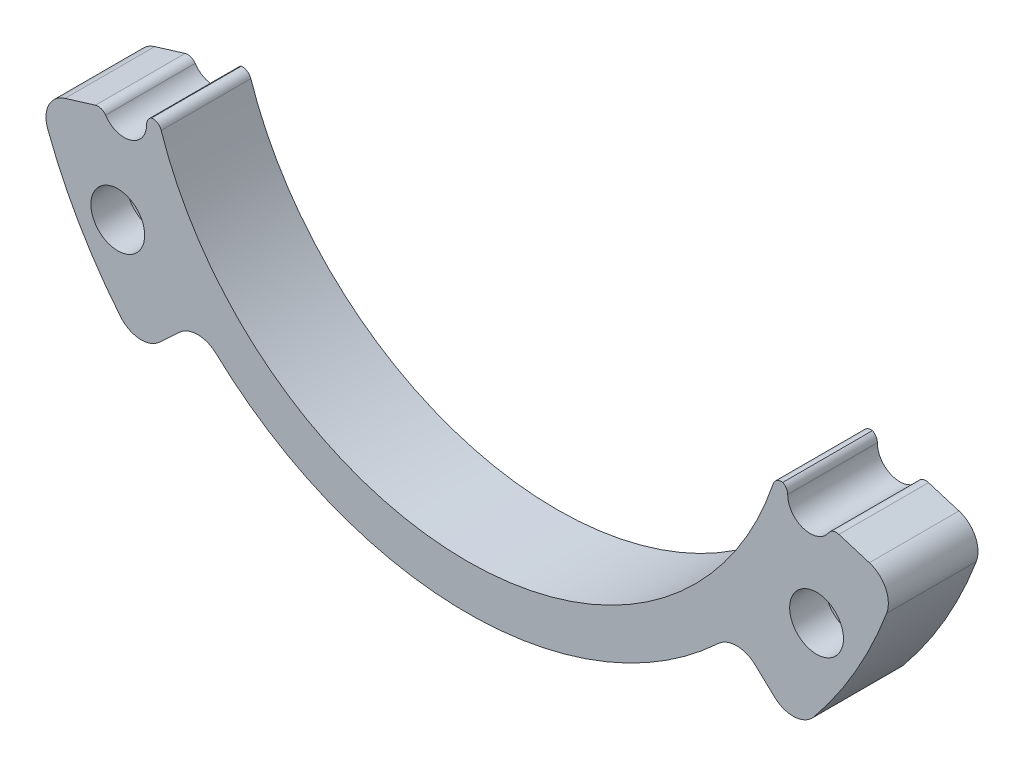
ISO-10303-21;
HEADER;
FILE_DESCRIPTION(('STEP AP214'),'2;1');
FILE_NAME('part.step','',(''),(''),'','','');
FILE_SCHEMA(('AUTOMOTIVE_DESIGN { 1 0 10303 214 1 1 1 1 }'));
ENDSEC;
DATA;
#1=APPLICATION_CONTEXT('core data for automotive mechanical design processes');
#2=APPLICATION_PROTOCOL_DEFINITION('international standard','automotive_design',2000,#1);
#3=PRODUCT_CONTEXT('',#1,'mechanical');
#4=PRODUCT('Part','Part','',(#3));
#5=PRODUCT_RELATED_PRODUCT_CATEGORY('part','',(#4));
#6=PRODUCT_DEFINITION_FORMATION('','',#4);
#7=PRODUCT_DEFINITION_CONTEXT('part definition',#1,'design');
#8=PRODUCT_DEFINITION('design','',#6,#7);
#9=PRODUCT_DEFINITION_SHAPE('','',#8);
#10=(LENGTH_UNIT() NAMED_UNIT(*) SI_UNIT(.MILLI.,.METRE.));
#11=(NAMED_UNIT(*) PLANE_ANGLE_UNIT() SI_UNIT($,.RADIAN.));
#12=(NAMED_UNIT(*) SI_UNIT($,.STERADIAN.) SOLID_ANGLE_UNIT());
#13=UNCERTAINTY_MEASURE_WITH_UNIT(LENGTH_MEASURE(1.E-05),#10,'distance_accuracy_value','');
#14=(GEOMETRIC_REPRESENTATION_CONTEXT(3) GLOBAL_UNCERTAINTY_ASSIGNED_CONTEXT((#13)) GLOBAL_UNIT_ASSIGNED_CONTEXT((#10,
#11,#12)) REPRESENTATION_CONTEXT('',''));
#15=CARTESIAN_POINT('',(0.,0.,0.));
#16=DIRECTION('',(0.,0.,1.));
#17=DIRECTION('',(1.,0.,0.));
#18=AXIS2_PLACEMENT_3D('',#15,#16,#17);
#19=CARTESIAN_POINT('',(38.9711431702997,-22.4999999999999,10.));
#20=DIRECTION('',(0.,0.,-1.));
#21=DIRECTION('',(-1.,0.,0.));
#22=AXIS2_PLACEMENT_3D('',#19,#20,#21);
#23=CYLINDRICAL_SURFACE('',#22,1.60000000000003);
#24=CARTESIAN_POINT('',(38.9711431702997,-22.4999999999999,0.));
#25=DIRECTION('',(0.,0.,1.));
#26=DIRECTION('',(1.,0.,0.));
#27=AXIS2_PLACEMENT_3D('',#24,#25,#26);
#28=CIRCLE('',#27,1.60000000000003);
#29=CARTESIAN_POINT('',(40.5711431702998,-22.4999999999999,0.));
#30=VERTEX_POINT('',#29);
#31=EDGE_CURVE('E382',#30,#30,#28,.T.);
#32=ORIENTED_EDGE('',*,*,#31,.F.);
#33=EDGE_LOOP('',(#32));
#34=FACE_BOUND('',#33,.T.);
#35=CARTESIAN_POINT('',(38.9711431702997,-22.4999999999999,6.));
#36=DIRECTION('',(0.,0.,1.));
#37=DIRECTION('',(1.,0.,0.));
#38=AXIS2_PLACEMENT_3D('',#35,#36,#37);
#39=CIRCLE('',#38,1.60000000000003);
#40=CARTESIAN_POINT('',(40.5711431702998,-22.4999999999999,6.));
#41=VERTEX_POINT('',#40);
#42=EDGE_CURVE('E222',#41,#41,#39,.T.);
#43=ORIENTED_EDGE('',*,*,#42,.T.);
#44=EDGE_LOOP('',(#43));
#45=FACE_BOUND('',#44,.T.);
#46=ADVANCED_FACE('F34',(#34,#45),#23,.F.);
#47=CARTESIAN_POINT('',(-38.9711431702998,-22.4999999999999,10.));
#48=DIRECTION('',(0.,0.,-1.));
#49=DIRECTION('',(-1.,0.,0.));
#50=AXIS2_PLACEMENT_3D('',#47,#48,#49);
#51=CYLINDRICAL_SURFACE('',#50,1.60000000000002);
#52=CARTESIAN_POINT('',(-38.9711431702998,-22.4999999999999,0.));
#53=DIRECTION('',(0.,0.,1.));
#54=DIRECTION('',(1.,0.,0.));
#55=AXIS2_PLACEMENT_3D('',#52,#53,#54);
#56=CIRCLE('',#55,1.60000000000002);
#57=CARTESIAN_POINT('',(-37.3711431702998,-22.4999999999999,0.));
#58=VERTEX_POINT('',#57);
#59=EDGE_CURVE('E349',#58,#58,#56,.T.);
#60=ORIENTED_EDGE('',*,*,#59,.F.);
#61=EDGE_LOOP('',(#60));
#62=FACE_BOUND('',#61,.T.);
#63=CARTESIAN_POINT('',(-38.9711431702998,-22.4999999999999,6.));
#64=DIRECTION('',(0.,0.,1.));
#65=DIRECTION('',(1.,0.,0.));
#66=AXIS2_PLACEMENT_3D('',#63,#64,#65);
#67=CIRCLE('',#66,1.60000000000002);
#68=CARTESIAN_POINT('',(-37.3711431702998,-22.4999999999999,6.));
#69=VERTEX_POINT('',#68);
#70=EDGE_CURVE('E359',#69,#69,#67,.T.);
#71=ORIENTED_EDGE('',*,*,#70,.T.);
#72=EDGE_LOOP('',(#71));
#73=FACE_BOUND('',#72,.T.);
#74=ADVANCED_FACE('F467',(#62,#73),#51,.F.);
#75=CARTESIAN_POINT('',(34.4269712146693,-10.5253813700185,10.));
#76=DIRECTION('',(-0.292371704722734,-0.956304755963036,0.));
#77=DIRECTION('',(0.956304755963036,-0.292371704722734,0.));
#78=AXIS2_PLACEMENT_3D('',#75,#76,#77);
#79=PLANE('',#78);
#80=DIRECTION('',(-0.956304755963036,0.292371704722734,0.));
#81=VECTOR('',#80,1.);
#82=CARTESIAN_POINT('',(34.4269712146693,-10.5253813700185,10.));
#83=LINE('',#82,#81);
#84=CARTESIAN_POINT('',(44.8546689856311,-13.7134485155796,10.));
#85=VERTEX_POINT('',#84);
#86=CARTESIAN_POINT('',(41.4597339008309,-12.6755126985958,10.));
#87=VERTEX_POINT('',#86);
#88=EDGE_CURVE('E337',#85,#87,#83,.T.);
#89=ORIENTED_EDGE('',*,*,#88,.F.);
#90=DIRECTION('',(0.,0.,-1.));
#91=VECTOR('',#90,1.);
#92=CARTESIAN_POINT('',(44.8546689856311,-13.7134485155796,10.));
#93=LINE('',#92,#91);
#94=CARTESIAN_POINT('',(44.8546689856311,-13.7134485155796,0.));
#95=VERTEX_POINT('',#94);
#96=EDGE_CURVE('E192',#85,#95,#93,.T.);
#97=ORIENTED_EDGE('',*,*,#96,.T.);
#98=DIRECTION('',(-0.956304755963036,0.292371704722734,0.));
#99=VECTOR('',#98,1.);
#100=CARTESIAN_POINT('',(34.4269712146693,-10.5253813700185,0.));
#101=LINE('',#100,#99);
#102=CARTESIAN_POINT('',(41.4597339008309,-12.6755126985958,0.));
#103=VERTEX_POINT('',#102);
#104=EDGE_CURVE('E185',#95,#103,#101,.T.);
#105=ORIENTED_EDGE('',*,*,#104,.T.);
#106=DIRECTION('',(0.,0.,1.));
#107=VECTOR('',#106,1.);
#108=CARTESIAN_POINT('',(41.4597339008309,-12.6755126985958,10.));
#109=LINE('',#108,#107);
#110=EDGE_CURVE('E190',#103,#87,#109,.T.);
#111=ORIENTED_EDGE('',*,*,#110,.T.);
#112=EDGE_LOOP('',(#89,#97,#105,#111));
#113=FACE_BOUND('',#112,.T.);
#114=ADVANCED_FACE('F188',(#113),#79,.F.);
#115=CARTESIAN_POINT('',(0.,0.,10.));
#116=DIRECTION('',(0.,0.,1.));
#117=DIRECTION('',(1.,0.,0.));
#118=AXIS2_PLACEMENT_3D('',#115,#116,#117);
#119=PLANE('',#118);
#120=CARTESIAN_POINT('',(38.9711431702997,-22.4999999999999,10.));
#121=DIRECTION('',(0.,0.,1.));
#122=DIRECTION('',(1.,0.,0.));
#123=AXIS2_PLACEMENT_3D('',#120,#121,#122);
#124=CIRCLE('',#123,3.);
#125=CARTESIAN_POINT('',(41.9711431702997,-22.4999999999999,10.));
#126=VERTEX_POINT('',#125);
#127=EDGE_CURVE('E262',#126,#126,#124,.T.);
#128=ORIENTED_EDGE('',*,*,#127,.F.);
#129=EDGE_LOOP('',(#128));
#130=FACE_BOUND('',#129,.T.);
#131=CARTESIAN_POINT('',(-38.9711431702998,-22.4999999999999,10.));
#132=DIRECTION('',(0.,0.,1.));
#133=DIRECTION('',(1.,0.,0.));
#134=AXIS2_PLACEMENT_3D('',#131,#132,#133);
#135=CIRCLE('',#134,3.);
#136=CARTESIAN_POINT('',(-35.9711431702998,-22.4999999999999,10.));
#137=VERTEX_POINT('',#136);
#138=EDGE_CURVE('E368',#137,#137,#135,.T.);
#139=ORIENTED_EDGE('',*,*,#138,.F.);
#140=EDGE_LOOP('',(#139));
#141=FACE_BOUND('',#140,.T.);
#142=DIRECTION('',(-0.956304755963033,-0.292371704722746,0.));
#143=VECTOR('',#142,1.);
#144=CARTESIAN_POINT('',(-34.4269712146693,-10.5253813700185,10.));
#145=LINE('',#144,#143);
#146=CARTESIAN_POINT('',(-41.4597339008309,-12.6755126985958,10.));
#147=VERTEX_POINT('',#146);
#148=CARTESIAN_POINT('',(-44.8546689856312,-13.7134485155797,10.));
#149=VERTEX_POINT('',#148);
#150=EDGE_CURVE('E214',#147,#149,#145,.T.);
#151=ORIENTED_EDGE('',*,*,#150,.T.);
#152=CARTESIAN_POINT('',(-43.9775538714629,-16.5823627834688,10.));
#153=DIRECTION('',(0.,0.,1.));
#154=DIRECTION('',(1.,0.,0.));
#155=AXIS2_PLACEMENT_3D('',#152,#153,#154);
#156=CIRCLE('',#155,3.);
#157=CARTESIAN_POINT('',(-46.7846317781521,-17.6408114717754,10.));
#158=VERTEX_POINT('',#157);
#159=EDGE_CURVE('E285',#149,#158,#156,.T.);
#160=ORIENTED_EDGE('',*,*,#159,.T.);
#161=CARTESIAN_POINT('',(0.,0.,10.));
#162=DIRECTION('',(0.,0.,1.));
#163=DIRECTION('',(1.,0.,0.));
#164=AXIS2_PLACEMENT_3D('',#161,#162,#163);
#165=CIRCLE('',#164,50.);
#166=CARTESIAN_POINT('',(-38.6697067670053,-31.6962738906929,10.));
#167=VERTEX_POINT('',#166);
#168=EDGE_CURVE('E358',#158,#167,#165,.T.);
#169=ORIENTED_EDGE('',*,*,#168,.T.);
#170=CARTESIAN_POINT('',(-36.349524360985,-29.7944974572513,10.));
#171=DIRECTION('',(0.,0.,1.));
#172=DIRECTION('',(1.,0.,0.));
#173=AXIS2_PLACEMENT_3D('',#170,#171,#172);
#174=CIRCLE('',#173,3.);
#175=CARTESIAN_POINT('',(-34.3035292807975,-31.9885585621089,10.));
#176=VERTEX_POINT('',#175);
#177=EDGE_CURVE('E283',#167,#176,#174,.T.);
#178=ORIENTED_EDGE('',*,*,#177,.T.);
#179=DIRECTION('',(0.731353701619168,0.681998360062501,0.));
#180=VECTOR('',#179,1.);
#181=CARTESIAN_POINT('',(-29.9855017663859,-27.9619327625625,10.));
#182=LINE('',#181,#180);
#183=CARTESIAN_POINT('',(-32.1046782019764,-29.9380967589381,10.));
#184=VERTEX_POINT('',#183);
#185=EDGE_CURVE('E339',#176,#184,#182,.T.);
#186=ORIENTED_EDGE('',*,*,#185,.T.);
#187=CARTESIAN_POINT('',(-30.0586831217889,-32.1321578637956,10.));
#188=DIRECTION('',(0.,0.,1.));
#189=DIRECTION('',(1.,0.,0.));
#190=AXIS2_PLACEMENT_3D('',#187,#188,#189);
#191=CIRCLE('',#190,3.);
#192=CARTESIAN_POINT('',(-28.0092274543942,-29.9413289185368,10.));
#193=VERTEX_POINT('',#192);
#194=EDGE_CURVE('E309',#184,#193,#191,.F.);
#195=ORIENTED_EDGE('',*,*,#194,.T.);
#196=CARTESIAN_POINT('',(0.,0.,10.));
#197=DIRECTION('',(0.,0.,1.));
#198=DIRECTION('',(1.,0.,0.));
#199=AXIS2_PLACEMENT_3D('',#196,#197,#198);
#200=CIRCLE('',#199,41.);
#201=CARTESIAN_POINT('',(28.0092274543944,-29.9413289185366,10.));
#202=VERTEX_POINT('',#201);
#203=EDGE_CURVE('E331',#193,#202,#200,.T.);
#204=ORIENTED_EDGE('',*,*,#203,.T.);
#205=CARTESIAN_POINT('',(30.0586831217892,-32.1321578637954,10.));
#206=DIRECTION('',(0.,0.,1.));
#207=DIRECTION('',(1.,0.,0.));
#208=AXIS2_PLACEMENT_3D('',#205,#206,#207);
#209=CIRCLE('',#208,3.);
#210=CARTESIAN_POINT('',(32.1046782019766,-29.9380967589379,10.));
#211=VERTEX_POINT('',#210);
#212=EDGE_CURVE('E11',#202,#211,#209,.F.);
#213=ORIENTED_EDGE('',*,*,#212,.T.);
#214=DIRECTION('',(0.731353701619173,-0.681998360062496,0.));
#215=VECTOR('',#214,1.);
#216=CARTESIAN_POINT('',(29.9855017663861,-27.9619327625623,10.));
#217=LINE('',#216,#215);
#218=CARTESIAN_POINT('',(34.3035292807977,-31.9885585621086,10.));
#219=VERTEX_POINT('',#218);
#220=EDGE_CURVE('E330',#211,#219,#217,.T.);
#221=ORIENTED_EDGE('',*,*,#220,.T.);
#222=CARTESIAN_POINT('',(36.3495243609852,-29.7944974572511,10.));
#223=DIRECTION('',(0.,0.,1.));
#224=DIRECTION('',(1.,0.,0.));
#225=AXIS2_PLACEMENT_3D('',#222,#223,#224);
#226=CIRCLE('',#225,3.);
#227=CARTESIAN_POINT('',(38.6697067670055,-31.6962738906926,10.));
#228=VERTEX_POINT('',#227);
#229=EDGE_CURVE('E56',#219,#228,#226,.T.);
#230=ORIENTED_EDGE('',*,*,#229,.T.);
#231=CARTESIAN_POINT('',(0.,0.,10.));
#232=DIRECTION('',(0.,0.,1.));
#233=DIRECTION('',(1.,0.,0.));
#234=AXIS2_PLACEMENT_3D('',#231,#232,#233);
#235=CIRCLE('',#234,49.9999999999999);
#236=CARTESIAN_POINT('',(46.7846317781521,-17.6408114717753,10.));
#237=VERTEX_POINT('',#236);
#238=EDGE_CURVE('E335',#228,#237,#235,.T.);
#239=ORIENTED_EDGE('',*,*,#238,.T.);
#240=CARTESIAN_POINT('',(43.9775538714629,-16.5823627834687,10.));
#241=DIRECTION('',(0.,0.,1.));
#242=DIRECTION('',(1.,0.,0.));
#243=AXIS2_PLACEMENT_3D('',#240,#241,#242);
#244=CIRCLE('',#243,3.);
#245=EDGE_CURVE('E280',#237,#85,#244,.T.);
#246=ORIENTED_EDGE('',*,*,#245,.T.);
#247=ORIENTED_EDGE('',*,*,#88,.T.);
#248=CARTESIAN_POINT('',(41.1673621961082,-13.6318174545588,10.));
#249=DIRECTION('',(0.,0.,1.));
#250=DIRECTION('',(1.,0.,0.));
#251=AXIS2_PLACEMENT_3D('',#248,#249,#250);
#252=CIRCLE('',#251,1.);
#253=CARTESIAN_POINT('',(40.334455922512,-13.078403378659,10.));
#254=VERTEX_POINT('',#253);
#255=EDGE_CURVE('E212',#87,#254,#252,.T.);
#256=ORIENTED_EDGE('',*,*,#255,.T.);
#257=CARTESIAN_POINT('',(38.2521902385214,-11.6948681889095,10.));
#258=DIRECTION('',(0.,0.,1.));
#259=DIRECTION('',(-1.,0.,0.));
#260=AXIS2_PLACEMENT_3D('',#257,#258,#259);
#261=CIRCLE('',#260,2.5);
#262=CARTESIAN_POINT('',(35.7522506906412,-11.6774826505357,10.));
#263=VERTEX_POINT('',#262);
#264=EDGE_CURVE('E361',#263,#254,#261,.T.);
#265=ORIENTED_EDGE('',*,*,#264,.F.);
#266=CARTESIAN_POINT('',(34.7522748714891,-11.6705284351862,10.));
#267=DIRECTION('',(0.,0.,1.));
#268=DIRECTION('',(1.,0.,0.));
#269=AXIS2_PLACEMENT_3D('',#266,#267,#268);
#270=CIRCLE('',#269,1.);
#271=CARTESIAN_POINT('',(35.2032280392347,-10.7779808227306,10.));
#272=VERTEX_POINT('',#271);
#273=EDGE_CURVE('E230',#263,#272,#270,.T.);
#274=ORIENTED_EDGE('',*,*,#273,.T.);
#275=CARTESIAN_POINT('',(35.0779788678635,-11.7701061399515,10.));
#276=DIRECTION('',(0.,0.,1.));
#277=DIRECTION('',(1.,0.,0.));
#278=AXIS2_PLACEMENT_3D('',#275,#276,#277);
#279=CIRCLE('',#278,1.);
#280=CARTESIAN_POINT('',(34.1299253849482,-11.4519951631961,10.));
#281=VERTEX_POINT('',#280);
#282=EDGE_CURVE('E228',#272,#281,#279,.T.);
#283=ORIENTED_EDGE('',*,*,#282,.T.);
#284=CARTESIAN_POINT('',(0.,0.,10.));
#285=DIRECTION('',(0.,0.,-1.));
#286=DIRECTION('',(1.,0.,0.));
#287=AXIS2_PLACEMENT_3D('',#284,#285,#286);
#288=CIRCLE('',#287,36.);
#289=CARTESIAN_POINT('',(-34.1299253849482,-11.4519951631961,10.));
#290=VERTEX_POINT('',#289);
#291=EDGE_CURVE('E219',#281,#290,#288,.T.);
#292=ORIENTED_EDGE('',*,*,#291,.T.);
#293=CARTESIAN_POINT('',(-35.0779788678635,-11.7701061399515,10.));
#294=DIRECTION('',(0.,0.,1.));
#295=DIRECTION('',(1.,0.,0.));
#296=AXIS2_PLACEMENT_3D('',#293,#294,#295);
#297=CIRCLE('',#296,1.);
#298=CARTESIAN_POINT('',(-35.2032280392347,-10.7779808227305,10.));
#299=VERTEX_POINT('',#298);
#300=EDGE_CURVE('E213',#290,#299,#297,.T.);
#301=ORIENTED_EDGE('',*,*,#300,.T.);
#302=CARTESIAN_POINT('',(-34.7522748714891,-11.6705284351862,10.));
#303=DIRECTION('',(0.,0.,1.));
#304=DIRECTION('',(1.,0.,0.));
#305=AXIS2_PLACEMENT_3D('',#302,#303,#304);
#306=CIRCLE('',#305,1.);
#307=CARTESIAN_POINT('',(-35.7522506906412,-11.6774826505357,10.));
#308=VERTEX_POINT('',#307);
#309=EDGE_CURVE('E216',#299,#308,#306,.T.);
#310=ORIENTED_EDGE('',*,*,#309,.T.);
#311=CARTESIAN_POINT('',(-38.2521902385214,-11.6948681889095,10.));
#312=DIRECTION('',(0.,0.,1.));
#313=DIRECTION('',(1.,0.,0.));
#314=AXIS2_PLACEMENT_3D('',#311,#312,#313);
#315=CIRCLE('',#314,2.5);
#316=CARTESIAN_POINT('',(-40.334455922512,-13.078403378659,10.));
#317=VERTEX_POINT('',#316);
#318=EDGE_CURVE('E377',#317,#308,#315,.T.);
#319=ORIENTED_EDGE('',*,*,#318,.F.);
#320=CARTESIAN_POINT('',(-41.1673621961082,-13.6318174545588,10.));
#321=DIRECTION('',(0.,0.,1.));
#322=DIRECTION('',(1.,0.,0.));
#323=AXIS2_PLACEMENT_3D('',#320,#321,#322);
#324=CIRCLE('',#323,1.);
#325=EDGE_CURVE('E226',#317,#147,#324,.T.);
#326=ORIENTED_EDGE('',*,*,#325,.T.);
#327=EDGE_LOOP('',(#151,#160,#169,#178,#186,#195,#204,#213,#221,#230,#239,#246,#247,#256,#265,
#274,#283,#292,#301,#310,#319,#326));
#328=FACE_BOUND('',#327,.T.);
#329=ADVANCED_FACE('F329',(#130,#141,#328),#119,.T.);
#330=CARTESIAN_POINT('',(0.,0.,0.));
#331=DIRECTION('',(0.,0.,1.));
#332=DIRECTION('',(1.,0.,0.));
#333=AXIS2_PLACEMENT_3D('',#330,#331,#332);
#334=PLANE('',#333);
#335=CARTESIAN_POINT('',(0.,0.,0.));
#336=DIRECTION('',(0.,0.,1.));
#337=DIRECTION('',(1.,0.,0.));
#338=AXIS2_PLACEMENT_3D('',#335,#336,#337);
#339=CIRCLE('',#338,50.);
#340=CARTESIAN_POINT('',(-46.7846317781521,-17.6408114717754,0.));
#341=VERTEX_POINT('',#340);
#342=CARTESIAN_POINT('',(-38.6697067670053,-31.6962738906929,0.));
#343=VERTEX_POINT('',#342);
#344=EDGE_CURVE('E346',#341,#343,#339,.T.);
#345=ORIENTED_EDGE('',*,*,#344,.F.);
#346=CARTESIAN_POINT('',(-43.9775538714629,-16.5823627834688,0.));
#347=DIRECTION('',(0.,0.,1.));
#348=DIRECTION('',(1.,0.,0.));
#349=AXIS2_PLACEMENT_3D('',#346,#347,#348);
#350=CIRCLE('',#349,3.);
#351=CARTESIAN_POINT('',(-44.8546689856312,-13.7134485155797,0.));
#352=VERTEX_POINT('',#351);
#353=EDGE_CURVE('E276',#341,#352,#350,.F.);
#354=ORIENTED_EDGE('',*,*,#353,.T.);
#355=DIRECTION('',(-0.956304755963033,-0.292371704722746,0.));
#356=VECTOR('',#355,1.);
#357=CARTESIAN_POINT('',(-34.4269712146693,-10.5253813700185,0.));
#358=LINE('',#357,#356);
#359=CARTESIAN_POINT('',(-41.4597339008309,-12.6755126985958,0.));
#360=VERTEX_POINT('',#359);
#361=EDGE_CURVE('E356',#360,#352,#358,.T.);
#362=ORIENTED_EDGE('',*,*,#361,.F.);
#363=CARTESIAN_POINT('',(-41.1673621961082,-13.6318174545588,0.));
#364=DIRECTION('',(0.,0.,1.));
#365=DIRECTION('',(1.,0.,0.));
#366=AXIS2_PLACEMENT_3D('',#363,#364,#365);
#367=CIRCLE('',#366,1.);
#368=CARTESIAN_POINT('',(-40.334455922512,-13.078403378659,0.));
#369=VERTEX_POINT('',#368);
#370=EDGE_CURVE('E242',#360,#369,#367,.F.);
#371=ORIENTED_EDGE('',*,*,#370,.T.);
#372=CARTESIAN_POINT('',(-38.2521902385214,-11.6948681889095,0.));
#373=DIRECTION('',(0.,0.,1.));
#374=DIRECTION('',(1.,0.,0.));
#375=AXIS2_PLACEMENT_3D('',#372,#373,#374);
#376=CIRCLE('',#375,2.5);
#377=CARTESIAN_POINT('',(-35.7522506906412,-11.6774826505357,0.));
#378=VERTEX_POINT('',#377);
#379=EDGE_CURVE('E379',#369,#378,#376,.T.);
#380=ORIENTED_EDGE('',*,*,#379,.T.);
#381=CARTESIAN_POINT('',(-34.7522748714891,-11.6705284351862,0.));
#382=DIRECTION('',(0.,0.,1.));
#383=DIRECTION('',(1.,0.,0.));
#384=AXIS2_PLACEMENT_3D('',#381,#382,#383);
#385=CIRCLE('',#384,1.);
#386=CARTESIAN_POINT('',(-35.2032280392347,-10.7779808227305,0.));
#387=VERTEX_POINT('',#386);
#388=EDGE_CURVE('E240',#378,#387,#385,.F.);
#389=ORIENTED_EDGE('',*,*,#388,.T.);
#390=CARTESIAN_POINT('',(-35.0779788678635,-11.7701061399515,0.));
#391=DIRECTION('',(0.,0.,1.));
#392=DIRECTION('',(1.,0.,0.));
#393=AXIS2_PLACEMENT_3D('',#390,#391,#392);
#394=CIRCLE('',#393,1.);
#395=CARTESIAN_POINT('',(-34.1299253849482,-11.4519951631961,0.));
#396=VERTEX_POINT('',#395);
#397=EDGE_CURVE('E238',#387,#396,#394,.F.);
#398=ORIENTED_EDGE('',*,*,#397,.T.);
#399=CARTESIAN_POINT('',(0.,0.,0.));
#400=DIRECTION('',(0.,0.,-1.));
#401=DIRECTION('',(1.,0.,0.));
#402=AXIS2_PLACEMENT_3D('',#399,#400,#401);
#403=CIRCLE('',#402,36.);
#404=CARTESIAN_POINT('',(34.1299253849482,-11.4519951631961,0.));
#405=VERTEX_POINT('',#404);
#406=EDGE_CURVE('E194',#405,#396,#403,.T.);
#407=ORIENTED_EDGE('',*,*,#406,.F.);
#408=CARTESIAN_POINT('',(35.0779788678635,-11.7701061399515,0.));
#409=DIRECTION('',(0.,0.,1.));
#410=DIRECTION('',(1.,0.,0.));
#411=AXIS2_PLACEMENT_3D('',#408,#409,#410);
#412=CIRCLE('',#411,1.);
#413=CARTESIAN_POINT('',(35.2032280392347,-10.7779808227306,0.));
#414=VERTEX_POINT('',#413);
#415=EDGE_CURVE('E244',#405,#414,#412,.F.);
#416=ORIENTED_EDGE('',*,*,#415,.T.);
#417=CARTESIAN_POINT('',(34.7522748714891,-11.6705284351862,0.));
#418=DIRECTION('',(0.,0.,1.));
#419=DIRECTION('',(1.,0.,0.));
#420=AXIS2_PLACEMENT_3D('',#417,#418,#419);
#421=CIRCLE('',#420,1.);
#422=CARTESIAN_POINT('',(35.7522506906412,-11.6774826505357,0.));
#423=VERTEX_POINT('',#422);
#424=EDGE_CURVE('E208',#414,#423,#421,.F.);
#425=ORIENTED_EDGE('',*,*,#424,.T.);
#426=CARTESIAN_POINT('',(38.2521902385214,-11.6948681889095,0.));
#427=DIRECTION('',(0.,0.,1.));
#428=DIRECTION('',(-1.,0.,0.));
#429=AXIS2_PLACEMENT_3D('',#426,#427,#428);
#430=CIRCLE('',#429,2.5);
#431=CARTESIAN_POINT('',(40.334455922512,-13.078403378659,0.));
#432=VERTEX_POINT('',#431);
#433=EDGE_CURVE('E204',#423,#432,#430,.T.);
#434=ORIENTED_EDGE('',*,*,#433,.T.);
#435=CARTESIAN_POINT('',(41.1673621961082,-13.6318174545588,0.));
#436=DIRECTION('',(0.,0.,1.));
#437=DIRECTION('',(1.,0.,0.));
#438=AXIS2_PLACEMENT_3D('',#435,#436,#437);
#439=CIRCLE('',#438,1.);
#440=EDGE_CURVE('E199',#432,#103,#439,.F.);
#441=ORIENTED_EDGE('',*,*,#440,.T.);
#442=ORIENTED_EDGE('',*,*,#104,.F.);
#443=CARTESIAN_POINT('',(43.9775538714629,-16.5823627834687,0.));
#444=DIRECTION('',(0.,0.,1.));
#445=DIRECTION('',(1.,0.,0.));
#446=AXIS2_PLACEMENT_3D('',#443,#444,#445);
#447=CIRCLE('',#446,3.);
#448=CARTESIAN_POINT('',(46.7846317781521,-17.6408114717753,0.));
#449=VERTEX_POINT('',#448);
#450=EDGE_CURVE('E270',#95,#449,#447,.F.);
#451=ORIENTED_EDGE('',*,*,#450,.T.);
#452=CARTESIAN_POINT('',(0.,0.,0.));
#453=DIRECTION('',(0.,0.,1.));
#454=DIRECTION('',(1.,0.,0.));
#455=AXIS2_PLACEMENT_3D('',#452,#453,#454);
#456=CIRCLE('',#455,49.9999999999999);
#457=CARTESIAN_POINT('',(38.6697067670055,-31.6962738906926,0.));
#458=VERTEX_POINT('',#457);
#459=EDGE_CURVE('E195',#458,#449,#456,.T.);
#460=ORIENTED_EDGE('',*,*,#459,.F.);
#461=CARTESIAN_POINT('',(36.3495243609852,-29.7944974572511,0.));
#462=DIRECTION('',(0.,0.,1.));
#463=DIRECTION('',(1.,0.,0.));
#464=AXIS2_PLACEMENT_3D('',#461,#462,#463);
#465=CIRCLE('',#464,3.);
#466=CARTESIAN_POINT('',(34.3035292807977,-31.9885585621086,0.));
#467=VERTEX_POINT('',#466);
#468=EDGE_CURVE('E272',#458,#467,#465,.F.);
#469=ORIENTED_EDGE('',*,*,#468,.T.);
#470=DIRECTION('',(0.731353701619173,-0.681998360062496,0.));
#471=VECTOR('',#470,1.);
#472=CARTESIAN_POINT('',(29.9855017663861,-27.9619327625623,0.));
#473=LINE('',#472,#471);
#474=CARTESIAN_POINT('',(32.1046782019766,-29.9380967589379,0.));
#475=VERTEX_POINT('',#474);
#476=EDGE_CURVE('E315',#475,#467,#473,.T.);
#477=ORIENTED_EDGE('',*,*,#476,.F.);
#478=CARTESIAN_POINT('',(30.0586831217892,-32.1321578637954,0.));
#479=DIRECTION('',(0.,0.,1.));
#480=DIRECTION('',(1.,0.,0.));
#481=AXIS2_PLACEMENT_3D('',#478,#479,#480);
#482=CIRCLE('',#481,3.);
#483=CARTESIAN_POINT('',(28.0092274543944,-29.9413289185366,0.));
#484=VERTEX_POINT('',#483);
#485=EDGE_CURVE('E42',#475,#484,#482,.T.);
#486=ORIENTED_EDGE('',*,*,#485,.T.);
#487=CARTESIAN_POINT('',(0.,0.,0.));
#488=DIRECTION('',(0.,0.,1.));
#489=DIRECTION('',(1.,0.,0.));
#490=AXIS2_PLACEMENT_3D('',#487,#488,#489);
#491=CIRCLE('',#490,41.);
#492=CARTESIAN_POINT('',(-28.0092274543942,-29.9413289185368,0.));
#493=VERTEX_POINT('',#492);
#494=EDGE_CURVE('E313',#493,#484,#491,.T.);
#495=ORIENTED_EDGE('',*,*,#494,.F.);
#496=CARTESIAN_POINT('',(-30.0586831217889,-32.1321578637956,0.));
#497=DIRECTION('',(0.,0.,1.));
#498=DIRECTION('',(1.,0.,0.));
#499=AXIS2_PLACEMENT_3D('',#496,#497,#498);
#500=CIRCLE('',#499,3.);
#501=CARTESIAN_POINT('',(-32.1046782019764,-29.9380967589381,0.));
#502=VERTEX_POINT('',#501);
#503=EDGE_CURVE('E307',#493,#502,#500,.T.);
#504=ORIENTED_EDGE('',*,*,#503,.T.);
#505=DIRECTION('',(0.731353701619168,0.681998360062501,0.));
#506=VECTOR('',#505,1.);
#507=CARTESIAN_POINT('',(-29.9855017663859,-27.9619327625625,0.));
#508=LINE('',#507,#506);
#509=CARTESIAN_POINT('',(-34.3035292807975,-31.9885585621089,0.));
#510=VERTEX_POINT('',#509);
#511=EDGE_CURVE('E324',#510,#502,#508,.T.);
#512=ORIENTED_EDGE('',*,*,#511,.F.);
#513=CARTESIAN_POINT('',(-36.349524360985,-29.7944974572513,0.));
#514=DIRECTION('',(0.,0.,1.));
#515=DIRECTION('',(1.,0.,0.));
#516=AXIS2_PLACEMENT_3D('',#513,#514,#515);
#517=CIRCLE('',#516,3.);
#518=EDGE_CURVE('E274',#510,#343,#517,.F.);
#519=ORIENTED_EDGE('',*,*,#518,.T.);
#520=EDGE_LOOP('',(#345,#354,#362,#371,#380,#389,#398,#407,#416,#425,#434,#441,#442,#451,#460,
#469,#477,#486,#495,#504,#512,#519));
#521=FACE_BOUND('',#520,.T.);
#522=ORIENTED_EDGE('',*,*,#59,.T.);
#523=EDGE_LOOP('',(#522));
#524=FACE_BOUND('',#523,.T.);
#525=ORIENTED_EDGE('',*,*,#31,.T.);
#526=EDGE_LOOP('',(#525));
#527=FACE_BOUND('',#526,.T.);
#528=ADVANCED_FACE('F201',(#521,#524,#527),#334,.F.);
#529=CARTESIAN_POINT('',(0.,0.,10.));
#530=DIRECTION('',(0.,0.,-1.));
#531=DIRECTION('',(-1.,0.,0.));
#532=AXIS2_PLACEMENT_3D('',#529,#530,#531);
#533=CYLINDRICAL_SURFACE('',#532,50.);
#534=ORIENTED_EDGE('',*,*,#168,.F.);
#535=DIRECTION('',(0.,0.,-1.));
#536=VECTOR('',#535,1.);
#537=CARTESIAN_POINT('',(-46.7846317781521,-17.6408114717754,10.));
#538=LINE('',#537,#536);
#539=EDGE_CURVE('E267',#158,#341,#538,.T.);
#540=ORIENTED_EDGE('',*,*,#539,.T.);
#541=ORIENTED_EDGE('',*,*,#344,.T.);
#542=DIRECTION('',(0.,0.,-1.));
#543=VECTOR('',#542,1.);
#544=CARTESIAN_POINT('',(-38.6697067670053,-31.6962738906929,10.));
#545=LINE('',#544,#543);
#546=EDGE_CURVE('E258',#343,#167,#545,.F.);
#547=ORIENTED_EDGE('',*,*,#546,.T.);
#548=EDGE_LOOP('',(#534,#540,#541,#547));
#549=FACE_BOUND('',#548,.T.);
#550=ADVANCED_FACE('F406',(#549),#533,.T.);
#551=CARTESIAN_POINT('',(-29.9855017663859,-27.9619327625625,10.));
#552=DIRECTION('',(-0.681998360062501,0.731353701619168,0.));
#553=DIRECTION('',(-0.731353701619168,-0.681998360062501,0.));
#554=AXIS2_PLACEMENT_3D('',#551,#552,#553);
#555=PLANE('',#554);
#556=ORIENTED_EDGE('',*,*,#185,.F.);
#557=DIRECTION('',(0.,0.,-1.));
#558=VECTOR('',#557,1.);
#559=CARTESIAN_POINT('',(-34.3035292807975,-31.9885585621089,10.));
#560=LINE('',#559,#558);
#561=EDGE_CURVE('E289',#176,#510,#560,.T.);
#562=ORIENTED_EDGE('',*,*,#561,.T.);
#563=ORIENTED_EDGE('',*,*,#511,.T.);
#564=DIRECTION('',(0.,0.,1.));
#565=VECTOR('',#564,1.);
#566=CARTESIAN_POINT('',(-32.1046782019764,-29.9380967589381,10.));
#567=LINE('',#566,#565);
#568=EDGE_CURVE('E287',#502,#184,#567,.T.);
#569=ORIENTED_EDGE('',*,*,#568,.T.);
#570=EDGE_LOOP('',(#556,#562,#563,#569));
#571=FACE_BOUND('',#570,.T.);
#572=ADVANCED_FACE('F400',(#571),#555,.F.);
#573=CARTESIAN_POINT('',(0.,0.,10.));
#574=DIRECTION('',(0.,0.,-1.));
#575=DIRECTION('',(-1.,0.,0.));
#576=AXIS2_PLACEMENT_3D('',#573,#574,#575);
#577=CYLINDRICAL_SURFACE('',#576,41.);
#578=ORIENTED_EDGE('',*,*,#203,.F.);
#579=DIRECTION('',(0.,0.,-1.));
#580=VECTOR('',#579,1.);
#581=CARTESIAN_POINT('',(-28.0092274543942,-29.9413289185368,10.));
#582=LINE('',#581,#580);
#583=EDGE_CURVE('E294',#193,#493,#582,.T.);
#584=ORIENTED_EDGE('',*,*,#583,.T.);
#585=ORIENTED_EDGE('',*,*,#494,.T.);
#586=DIRECTION('',(0.,0.,-1.));
#587=VECTOR('',#586,1.);
#588=CARTESIAN_POINT('',(28.0092274543944,-29.9413289185366,10.));
#589=LINE('',#588,#587);
#590=EDGE_CURVE('E292',#484,#202,#589,.F.);
#591=ORIENTED_EDGE('',*,*,#590,.T.);
#592=EDGE_LOOP('',(#578,#584,#585,#591));
#593=FACE_BOUND('',#592,.T.);
#594=ADVANCED_FACE('F321',(#593),#577,.T.);
#595=CARTESIAN_POINT('',(29.9855017663861,-27.9619327625623,10.));
#596=DIRECTION('',(0.681998360062496,0.731353701619173,0.));
#597=DIRECTION('',(-0.731353701619173,0.681998360062496,0.));
#598=AXIS2_PLACEMENT_3D('',#595,#596,#597);
#599=PLANE('',#598);
#600=ORIENTED_EDGE('',*,*,#476,.T.);
#601=DIRECTION('',(0.,0.,-1.));
#602=VECTOR('',#601,1.);
#603=CARTESIAN_POINT('',(34.3035292807977,-31.9885585621086,10.));
#604=LINE('',#603,#602);
#605=EDGE_CURVE('E304',#467,#219,#604,.F.);
#606=ORIENTED_EDGE('',*,*,#605,.T.);
#607=ORIENTED_EDGE('',*,*,#220,.F.);
#608=DIRECTION('',(0.,0.,1.));
#609=VECTOR('',#608,1.);
#610=CARTESIAN_POINT('',(32.1046782019766,-29.9380967589379,0.));
#611=LINE('',#610,#609);
#612=EDGE_CURVE('E301',#211,#475,#611,.F.);
#613=ORIENTED_EDGE('',*,*,#612,.T.);
#614=EDGE_LOOP('',(#600,#606,#607,#613));
#615=FACE_BOUND('',#614,.T.);
#616=ADVANCED_FACE('F333',(#615),#599,.F.);
#617=CARTESIAN_POINT('',(0.,0.,10.));
#618=DIRECTION('',(0.,0.,-1.));
#619=DIRECTION('',(-1.,0.,0.));
#620=AXIS2_PLACEMENT_3D('',#617,#618,#619);
#621=CYLINDRICAL_SURFACE('',#620,49.9999999999999);
#622=ORIENTED_EDGE('',*,*,#238,.F.);
#623=DIRECTION('',(0.,0.,-1.));
#624=VECTOR('',#623,1.);
#625=CARTESIAN_POINT('',(38.6697067670055,-31.6962738906926,10.));
#626=LINE('',#625,#624);
#627=EDGE_CURVE('E298',#228,#458,#626,.T.);
#628=ORIENTED_EDGE('',*,*,#627,.T.);
#629=ORIENTED_EDGE('',*,*,#459,.T.);
#630=DIRECTION('',(0.,0.,-1.));
#631=VECTOR('',#630,1.);
#632=CARTESIAN_POINT('',(46.7846317781521,-17.6408114717753,10.));
#633=LINE('',#632,#631);
#634=EDGE_CURVE('E49',#449,#237,#633,.F.);
#635=ORIENTED_EDGE('',*,*,#634,.T.);
#636=EDGE_LOOP('',(#622,#628,#629,#635));
#637=FACE_BOUND('',#636,.T.);
#638=ADVANCED_FACE('F455',(#637),#621,.T.);
#639=CARTESIAN_POINT('',(0.,0.,10.));
#640=DIRECTION('',(0.,0.,-1.));
#641=DIRECTION('',(-1.,0.,0.));
#642=AXIS2_PLACEMENT_3D('',#639,#640,#641);
#643=CYLINDRICAL_SURFACE('',#642,36.);
#644=ORIENTED_EDGE('',*,*,#291,.F.);
#645=DIRECTION('',(0.,0.,-1.));
#646=VECTOR('',#645,1.);
#647=CARTESIAN_POINT('',(34.1299253849482,-11.4519951631961,10.));
#648=LINE('',#647,#646);
#649=EDGE_CURVE('E248',#281,#405,#648,.T.);
#650=ORIENTED_EDGE('',*,*,#649,.T.);
#651=ORIENTED_EDGE('',*,*,#406,.T.);
#652=DIRECTION('',(0.,0.,-1.));
#653=VECTOR('',#652,1.);
#654=CARTESIAN_POINT('',(-34.1299253849482,-11.4519951631961,10.));
#655=LINE('',#654,#653);
#656=EDGE_CURVE('E207',#396,#290,#655,.F.);
#657=ORIENTED_EDGE('',*,*,#656,.T.);
#658=EDGE_LOOP('',(#644,#650,#651,#657));
#659=FACE_BOUND('',#658,.T.);
#660=ADVANCED_FACE('F438',(#659),#643,.F.);
#661=CARTESIAN_POINT('',(-34.4269712146693,-10.5253813700185,10.));
#662=DIRECTION('',(0.292371704722746,-0.956304755963033,0.));
#663=DIRECTION('',(0.956304755963033,0.292371704722746,0.));
#664=AXIS2_PLACEMENT_3D('',#661,#662,#663);
#665=PLANE('',#664);
#666=ORIENTED_EDGE('',*,*,#361,.T.);
#667=DIRECTION('',(0.,0.,-1.));
#668=VECTOR('',#667,1.);
#669=CARTESIAN_POINT('',(-44.8546689856312,-13.7134485155797,10.));
#670=LINE('',#669,#668);
#671=EDGE_CURVE('E278',#352,#149,#670,.F.);
#672=ORIENTED_EDGE('',*,*,#671,.T.);
#673=ORIENTED_EDGE('',*,*,#150,.F.);
#674=DIRECTION('',(0.,0.,1.));
#675=VECTOR('',#674,1.);
#676=CARTESIAN_POINT('',(-41.4597339008309,-12.6755126985958,10.));
#677=LINE('',#676,#675);
#678=EDGE_CURVE('E250',#147,#360,#677,.F.);
#679=ORIENTED_EDGE('',*,*,#678,.T.);
#680=EDGE_LOOP('',(#666,#672,#673,#679));
#681=FACE_BOUND('',#680,.T.);
#682=ADVANCED_FACE('F414',(#681),#665,.F.);
#683=CARTESIAN_POINT('',(-38.2521902385214,-11.6948681889095,0.));
#684=DIRECTION('',(0.,0.,1.));
#685=DIRECTION('',(1.,0.,0.));
#686=AXIS2_PLACEMENT_3D('',#683,#684,#685);
#687=CYLINDRICAL_SURFACE('',#686,2.5);
#688=ORIENTED_EDGE('',*,*,#379,.F.);
#689=DIRECTION('',(0.,0.,1.));
#690=VECTOR('',#689,1.);
#691=CARTESIAN_POINT('',(-40.334455922512,-13.078403378659,0.));
#692=LINE('',#691,#690);
#693=EDGE_CURVE('E256',#369,#317,#692,.T.);
#694=ORIENTED_EDGE('',*,*,#693,.T.);
#695=ORIENTED_EDGE('',*,*,#318,.T.);
#696=DIRECTION('',(0.,0.,1.));
#697=VECTOR('',#696,1.);
#698=CARTESIAN_POINT('',(-35.7522506906412,-11.6774826505357,0.));
#699=LINE('',#698,#697);
#700=EDGE_CURVE('E253',#308,#378,#699,.F.);
#701=ORIENTED_EDGE('',*,*,#700,.T.);
#702=EDGE_LOOP('',(#688,#694,#695,#701));
#703=FACE_BOUND('',#702,.T.);
#704=ADVANCED_FACE('F423',(#703),#687,.F.);
#705=CARTESIAN_POINT('',(38.2521902385214,-11.6948681889095,0.));
#706=DIRECTION('',(0.,0.,1.));
#707=DIRECTION('',(1.,0.,0.));
#708=AXIS2_PLACEMENT_3D('',#705,#706,#707);
#709=CYLINDRICAL_SURFACE('',#708,2.5);
#710=ORIENTED_EDGE('',*,*,#264,.T.);
#711=DIRECTION('',(0.,0.,1.));
#712=VECTOR('',#711,1.);
#713=CARTESIAN_POINT('',(40.334455922512,-13.078403378659,0.));
#714=LINE('',#713,#712);
#715=EDGE_CURVE('E236',#254,#432,#714,.F.);
#716=ORIENTED_EDGE('',*,*,#715,.T.);
#717=ORIENTED_EDGE('',*,*,#433,.F.);
#718=DIRECTION('',(0.,0.,1.));
#719=VECTOR('',#718,1.);
#720=CARTESIAN_POINT('',(35.7522506906412,-11.6774826505357,0.));
#721=LINE('',#720,#719);
#722=EDGE_CURVE('E233',#423,#263,#721,.T.);
#723=ORIENTED_EDGE('',*,*,#722,.T.);
#724=EDGE_LOOP('',(#710,#716,#717,#723));
#725=FACE_BOUND('',#724,.T.);
#726=ADVANCED_FACE('F451',(#725),#709,.F.);
#727=CARTESIAN_POINT('',(-38.9711431702998,-22.4999999999999,6.));
#728=DIRECTION('',(0.,0.,1.));
#729=DIRECTION('',(1.,0.,0.));
#730=AXIS2_PLACEMENT_3D('',#727,#728,#729);
#731=CYLINDRICAL_SURFACE('',#730,3.);
#732=CARTESIAN_POINT('',(-38.9711431702998,-22.4999999999999,6.));
#733=DIRECTION('',(0.,0.,1.));
#734=DIRECTION('',(1.,0.,0.));
#735=AXIS2_PLACEMENT_3D('',#732,#733,#734);
#736=CIRCLE('',#735,3.);
#737=CARTESIAN_POINT('',(-35.9711431702998,-22.4999999999999,6.));
#738=VERTEX_POINT('',#737);
#739=EDGE_CURVE('E362',#738,#738,#736,.T.);
#740=ORIENTED_EDGE('',*,*,#739,.F.);
#741=EDGE_LOOP('',(#740));
#742=FACE_BOUND('',#741,.T.);
#743=ORIENTED_EDGE('',*,*,#138,.T.);
#744=EDGE_LOOP('',(#743));
#745=FACE_BOUND('',#744,.T.);
#746=ADVANCED_FACE('F610',(#742,#745),#731,.F.);
#747=CARTESIAN_POINT('',(-38.9711431702998,-22.4999999999999,6.));
#748=DIRECTION('',(0.,0.,1.));
#749=DIRECTION('',(1.,0.,0.));
#750=AXIS2_PLACEMENT_3D('',#747,#748,#749);
#751=PLANE('',#750);
#752=ORIENTED_EDGE('',*,*,#70,.F.);
#753=EDGE_LOOP('',(#752));
#754=FACE_BOUND('',#753,.T.);
#755=ORIENTED_EDGE('',*,*,#739,.T.);
#756=EDGE_LOOP('',(#755));
#757=FACE_BOUND('',#756,.T.);
#758=ADVANCED_FACE('F601',(#754,#757),#751,.T.);
#759=CARTESIAN_POINT('',(38.9711431702997,-22.4999999999999,6.));
#760=DIRECTION('',(0.,0.,1.));
#761=DIRECTION('',(1.,0.,0.));
#762=AXIS2_PLACEMENT_3D('',#759,#760,#761);
#763=CYLINDRICAL_SURFACE('',#762,3.);
#764=CARTESIAN_POINT('',(38.9711431702997,-22.4999999999999,6.));
#765=DIRECTION('',(0.,0.,1.));
#766=DIRECTION('',(1.,0.,0.));
#767=AXIS2_PLACEMENT_3D('',#764,#765,#766);
#768=CIRCLE('',#767,3.);
#769=CARTESIAN_POINT('',(41.9711431702997,-22.4999999999999,6.));
#770=VERTEX_POINT('',#769);
#771=EDGE_CURVE('E717',#770,#770,#768,.T.);
#772=ORIENTED_EDGE('',*,*,#771,.F.);
#773=EDGE_LOOP('',(#772));
#774=FACE_BOUND('',#773,.T.);
#775=ORIENTED_EDGE('',*,*,#127,.T.);
#776=EDGE_LOOP('',(#775));
#777=FACE_BOUND('',#776,.T.);
#778=ADVANCED_FACE('F591',(#774,#777),#763,.F.);
#779=CARTESIAN_POINT('',(38.9711431702997,-22.4999999999999,6.));
#780=DIRECTION('',(0.,0.,1.));
#781=DIRECTION('',(1.,0.,0.));
#782=AXIS2_PLACEMENT_3D('',#779,#780,#781);
#783=PLANE('',#782);
#784=ORIENTED_EDGE('',*,*,#42,.F.);
#785=EDGE_LOOP('',(#784));
#786=FACE_BOUND('',#785,.T.);
#787=ORIENTED_EDGE('',*,*,#771,.T.);
#788=EDGE_LOOP('',(#787));
#789=FACE_BOUND('',#788,.T.);
#790=ADVANCED_FACE('F503',(#786,#789),#783,.T.);
#791=CARTESIAN_POINT('',(41.1673621961082,-13.6318174545588,0.));
#792=DIRECTION('',(0.,0.,1.));
#793=DIRECTION('',(1.,0.,0.));
#794=AXIS2_PLACEMENT_3D('',#791,#792,#793);
#795=CYLINDRICAL_SURFACE('',#794,1.);
#796=ORIENTED_EDGE('',*,*,#440,.F.);
#797=ORIENTED_EDGE('',*,*,#715,.F.);
#798=ORIENTED_EDGE('',*,*,#255,.F.);
#799=ORIENTED_EDGE('',*,*,#110,.F.);
#800=EDGE_LOOP('',(#796,#797,#798,#799));
#801=FACE_BOUND('',#800,.T.);
#802=ADVANCED_FACE('F211',(#801),#795,.T.);
#803=CARTESIAN_POINT('',(35.0779788678635,-11.7701061399515,10.));
#804=DIRECTION('',(0.,0.,-1.));
#805=DIRECTION('',(-1.,0.,0.));
#806=AXIS2_PLACEMENT_3D('',#803,#804,#805);
#807=CYLINDRICAL_SURFACE('',#806,1.);
#808=ORIENTED_EDGE('',*,*,#649,.F.);
#809=ORIENTED_EDGE('',*,*,#282,.F.);
#810=DIRECTION('',(0.,0.,-1.));
#811=VECTOR('',#810,1.);
#812=CARTESIAN_POINT('',(35.2032280392347,-10.7779808227306,5.));
#813=LINE('',#812,#811);
#814=EDGE_CURVE('E259',#414,#272,#813,.F.);
#815=ORIENTED_EDGE('',*,*,#814,.F.);
#816=ORIENTED_EDGE('',*,*,#415,.F.);
#817=EDGE_LOOP('',(#808,#809,#815,#816));
#818=FACE_BOUND('',#817,.T.);
#819=ADVANCED_FACE('F444',(#818),#807,.T.);
#820=CARTESIAN_POINT('',(34.7522748714891,-11.6705284351862,0.));
#821=DIRECTION('',(0.,0.,1.));
#822=DIRECTION('',(1.,0.,0.));
#823=AXIS2_PLACEMENT_3D('',#820,#821,#822);
#824=CYLINDRICAL_SURFACE('',#823,1.);
#825=ORIENTED_EDGE('',*,*,#273,.F.);
#826=ORIENTED_EDGE('',*,*,#722,.F.);
#827=ORIENTED_EDGE('',*,*,#424,.F.);
#828=ORIENTED_EDGE('',*,*,#814,.T.);
#829=EDGE_LOOP('',(#825,#826,#827,#828));
#830=FACE_BOUND('',#829,.T.);
#831=ADVANCED_FACE('F448',(#830),#824,.T.);
#832=CARTESIAN_POINT('',(-41.1673621961082,-13.6318174545588,0.));
#833=DIRECTION('',(0.,0.,1.));
#834=DIRECTION('',(1.,0.,0.));
#835=AXIS2_PLACEMENT_3D('',#832,#833,#834);
#836=CYLINDRICAL_SURFACE('',#835,1.);
#837=ORIENTED_EDGE('',*,*,#325,.F.);
#838=ORIENTED_EDGE('',*,*,#693,.F.);
#839=ORIENTED_EDGE('',*,*,#370,.F.);
#840=ORIENTED_EDGE('',*,*,#678,.F.);
#841=EDGE_LOOP('',(#837,#838,#839,#840));
#842=FACE_BOUND('',#841,.T.);
#843=ADVANCED_FACE('F419',(#842),#836,.T.);
#844=CARTESIAN_POINT('',(-35.0779788678635,-11.7701061399515,10.));
#845=DIRECTION('',(0.,0.,-1.));
#846=DIRECTION('',(-1.,0.,0.));
#847=AXIS2_PLACEMENT_3D('',#844,#845,#846);
#848=CYLINDRICAL_SURFACE('',#847,1.);
#849=ORIENTED_EDGE('',*,*,#656,.F.);
#850=ORIENTED_EDGE('',*,*,#397,.F.);
#851=DIRECTION('',(0.,0.,-1.));
#852=VECTOR('',#851,1.);
#853=CARTESIAN_POINT('',(-35.2032280392347,-10.7779808227305,5.));
#854=LINE('',#853,#852);
#855=EDGE_CURVE('E263',#299,#387,#854,.T.);
#856=ORIENTED_EDGE('',*,*,#855,.F.);
#857=ORIENTED_EDGE('',*,*,#300,.F.);
#858=EDGE_LOOP('',(#849,#850,#856,#857));
#859=FACE_BOUND('',#858,.T.);
#860=ADVANCED_FACE('F434',(#859),#848,.T.);
#861=CARTESIAN_POINT('',(-34.7522748714891,-11.6705284351862,0.));
#862=DIRECTION('',(0.,0.,1.));
#863=DIRECTION('',(1.,0.,0.));
#864=AXIS2_PLACEMENT_3D('',#861,#862,#863);
#865=CYLINDRICAL_SURFACE('',#864,1.);
#866=ORIENTED_EDGE('',*,*,#388,.F.);
#867=ORIENTED_EDGE('',*,*,#700,.F.);
#868=ORIENTED_EDGE('',*,*,#309,.F.);
#869=ORIENTED_EDGE('',*,*,#855,.T.);
#870=EDGE_LOOP('',(#866,#867,#868,#869));
#871=FACE_BOUND('',#870,.T.);
#872=ADVANCED_FACE('F428',(#871),#865,.T.);
#873=CARTESIAN_POINT('',(-43.9775538714629,-16.5823627834688,10.));
#874=DIRECTION('',(0.,0.,-1.));
#875=DIRECTION('',(-1.,0.,0.));
#876=AXIS2_PLACEMENT_3D('',#873,#874,#875);
#877=CYLINDRICAL_SURFACE('',#876,3.);
#878=ORIENTED_EDGE('',*,*,#159,.F.);
#879=ORIENTED_EDGE('',*,*,#671,.F.);
#880=ORIENTED_EDGE('',*,*,#353,.F.);
#881=ORIENTED_EDGE('',*,*,#539,.F.);
#882=EDGE_LOOP('',(#878,#879,#880,#881));
#883=FACE_BOUND('',#882,.T.);
#884=ADVANCED_FACE('F410',(#883),#877,.T.);
#885=CARTESIAN_POINT('',(-36.349524360985,-29.7944974572513,10.));
#886=DIRECTION('',(0.,0.,-1.));
#887=DIRECTION('',(-1.,0.,0.));
#888=AXIS2_PLACEMENT_3D('',#885,#886,#887);
#889=CYLINDRICAL_SURFACE('',#888,3.);
#890=ORIENTED_EDGE('',*,*,#177,.F.);
#891=ORIENTED_EDGE('',*,*,#546,.F.);
#892=ORIENTED_EDGE('',*,*,#518,.F.);
#893=ORIENTED_EDGE('',*,*,#561,.F.);
#894=EDGE_LOOP('',(#890,#891,#892,#893));
#895=FACE_BOUND('',#894,.T.);
#896=ADVANCED_FACE('F402',(#895),#889,.T.);
#897=CARTESIAN_POINT('',(-30.0586831217889,-32.1321578637956,10.));
#898=DIRECTION('',(0.,0.,-1.));
#899=DIRECTION('',(-1.,0.,0.));
#900=AXIS2_PLACEMENT_3D('',#897,#898,#899);
#901=CYLINDRICAL_SURFACE('',#900,3.);
#902=ORIENTED_EDGE('',*,*,#194,.F.);
#903=ORIENTED_EDGE('',*,*,#568,.F.);
#904=ORIENTED_EDGE('',*,*,#503,.F.);
#905=ORIENTED_EDGE('',*,*,#583,.F.);
#906=EDGE_LOOP('',(#902,#903,#904,#905));
#907=FACE_BOUND('',#906,.T.);
#908=ADVANCED_FACE('F398',(#907),#901,.F.);
#909=CARTESIAN_POINT('',(36.3495243609852,-29.7944974572511,10.));
#910=DIRECTION('',(0.,0.,-1.));
#911=DIRECTION('',(-1.,0.,0.));
#912=AXIS2_PLACEMENT_3D('',#909,#910,#911);
#913=CYLINDRICAL_SURFACE('',#912,3.);
#914=ORIENTED_EDGE('',*,*,#229,.F.);
#915=ORIENTED_EDGE('',*,*,#605,.F.);
#916=ORIENTED_EDGE('',*,*,#468,.F.);
#917=ORIENTED_EDGE('',*,*,#627,.F.);
#918=EDGE_LOOP('',(#914,#915,#916,#917));
#919=FACE_BOUND('',#918,.T.);
#920=ADVANCED_FACE('F458',(#919),#913,.T.);
#921=CARTESIAN_POINT('',(30.0586831217892,-32.1321578637954,10.));
#922=DIRECTION('',(0.,0.,-1.));
#923=DIRECTION('',(-1.,0.,0.));
#924=AXIS2_PLACEMENT_3D('',#921,#922,#923);
#925=CYLINDRICAL_SURFACE('',#924,3.);
#926=ORIENTED_EDGE('',*,*,#212,.F.);
#927=ORIENTED_EDGE('',*,*,#590,.F.);
#928=ORIENTED_EDGE('',*,*,#485,.F.);
#929=ORIENTED_EDGE('',*,*,#612,.F.);
#930=EDGE_LOOP('',(#926,#927,#928,#929));
#931=FACE_BOUND('',#930,.T.);
#932=ADVANCED_FACE('F327',(#931),#925,.F.);
#933=CARTESIAN_POINT('',(43.9775538714629,-16.5823627834687,10.));
#934=DIRECTION('',(0.,0.,-1.));
#935=DIRECTION('',(-1.,0.,0.));
#936=AXIS2_PLACEMENT_3D('',#933,#934,#935);
#937=CYLINDRICAL_SURFACE('',#936,3.);
#938=ORIENTED_EDGE('',*,*,#245,.F.);
#939=ORIENTED_EDGE('',*,*,#634,.F.);
#940=ORIENTED_EDGE('',*,*,#450,.F.);
#941=ORIENTED_EDGE('',*,*,#96,.F.);
#942=EDGE_LOOP('',(#938,#939,#940,#941));
#943=FACE_BOUND('',#942,.T.);
#944=ADVANCED_FACE('F36',(#943),#937,.T.);
#945=CLOSED_SHELL('',(#46,#74,#114,#329,#528,#550,#572,#594,#616,#638,#660,#682,#704,#726,#746,
#758,#778,#790,#802,#819,#831,#843,#860,#872,#884,#896,#908,#920,#932,#944));
#946=MANIFOLD_SOLID_BREP('B2',#945);
#947=ADVANCED_BREP_SHAPE_REPRESENTATION('',(#18,#946),#14);
#948=SHAPE_DEFINITION_REPRESENTATION(#9,#947);
ENDSEC;
END-ISO-10303-21;
